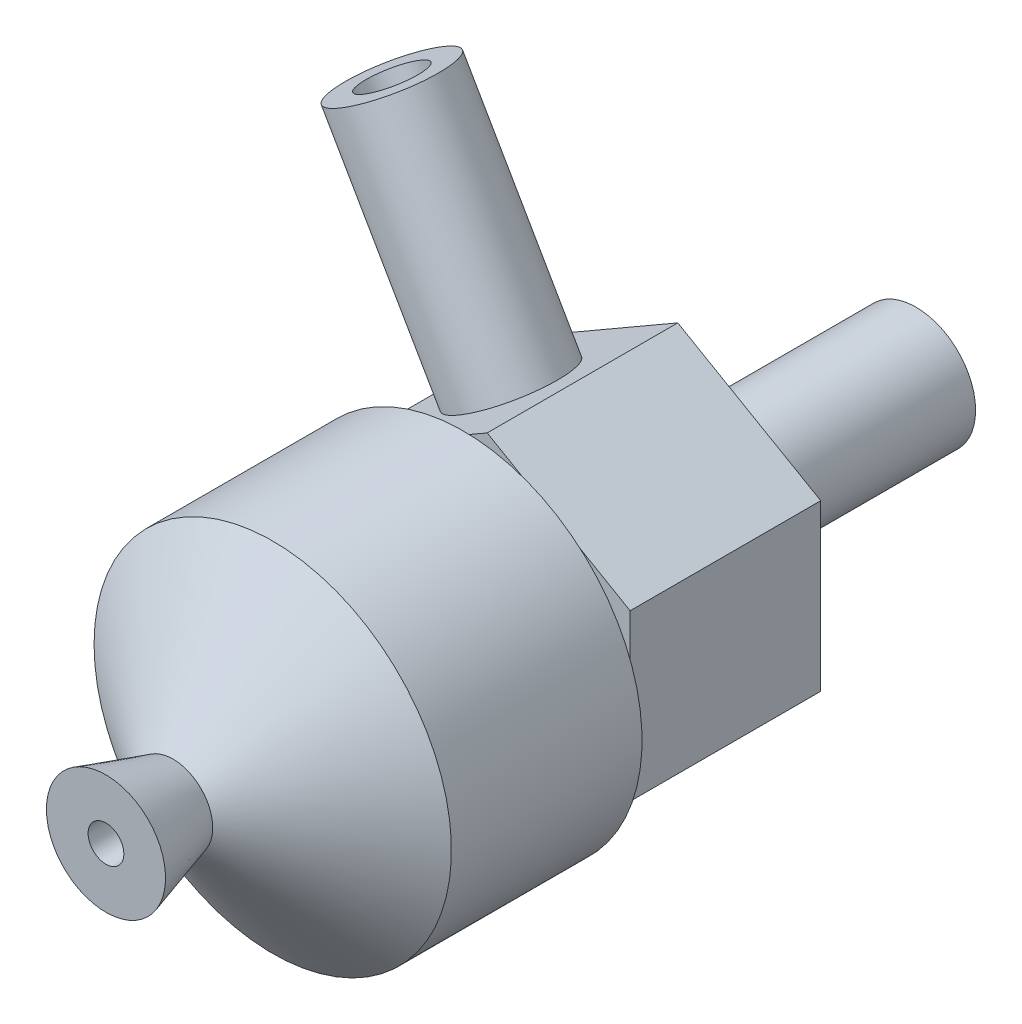
ISO-10303-21;
HEADER;
FILE_DESCRIPTION(('STEP AP214'),'2;1');
FILE_NAME('part.step','',(''),(''),'','','');
FILE_SCHEMA(('AUTOMOTIVE_DESIGN { 1 0 10303 214 1 1 1 1 }'));
ENDSEC;
DATA;
#1=APPLICATION_CONTEXT('core data for automotive mechanical design processes');
#2=APPLICATION_PROTOCOL_DEFINITION('international standard','automotive_design',2000,#1);
#3=PRODUCT_CONTEXT('',#1,'mechanical');
#4=PRODUCT('Part','Part','',(#3));
#5=PRODUCT_RELATED_PRODUCT_CATEGORY('part','',(#4));
#6=PRODUCT_DEFINITION_FORMATION('','',#4);
#7=PRODUCT_DEFINITION_CONTEXT('part definition',#1,'design');
#8=PRODUCT_DEFINITION('design','',#6,#7);
#9=PRODUCT_DEFINITION_SHAPE('','',#8);
#10=(LENGTH_UNIT() NAMED_UNIT(*) SI_UNIT(.MILLI.,.METRE.));
#11=(NAMED_UNIT(*) PLANE_ANGLE_UNIT() SI_UNIT($,.RADIAN.));
#12=(NAMED_UNIT(*) SI_UNIT($,.STERADIAN.) SOLID_ANGLE_UNIT());
#13=UNCERTAINTY_MEASURE_WITH_UNIT(LENGTH_MEASURE(1.E-05),#10,'distance_accuracy_value','');
#14=(GEOMETRIC_REPRESENTATION_CONTEXT(3) GLOBAL_UNCERTAINTY_ASSIGNED_CONTEXT((#13)) GLOBAL_UNIT_ASSIGNED_CONTEXT((#10,
#11,#12)) REPRESENTATION_CONTEXT('',''));
#15=CARTESIAN_POINT('',(0.,0.,0.));
#16=DIRECTION('',(0.,0.,1.));
#17=DIRECTION('',(1.,0.,0.));
#18=AXIS2_PLACEMENT_3D('',#15,#16,#17);
#19=CARTESIAN_POINT('',(0.,6.92820323027551,18.));
#20=DIRECTION('',(0.5,-0.866025403784439,0.));
#21=DIRECTION('',(0.866025403784439,0.5,0.));
#22=AXIS2_PLACEMENT_3D('',#19,#20,#21);
#23=PLANE('',#22);
#24=DIRECTION('',(-0.866025403784439,-0.5,0.));
#25=VECTOR('',#24,1.);
#26=CARTESIAN_POINT('',(0.,6.92820323027551,10.));
#27=LINE('',#26,#25);
#28=CARTESIAN_POINT('',(0.,6.92820323027551,10.));
#29=VERTEX_POINT('',#28);
#30=CARTESIAN_POINT('',(-6.,3.46410161513776,10.));
#31=VERTEX_POINT('',#30);
#32=EDGE_CURVE('E130',#29,#31,#27,.T.);
#33=ORIENTED_EDGE('',*,*,#32,.T.);
#34=DIRECTION('',(0.,0.,-1.));
#35=VECTOR('',#34,1.);
#36=CARTESIAN_POINT('',(-6.,3.46410161513776,18.));
#37=LINE('',#36,#35);
#38=CARTESIAN_POINT('',(-6.,3.46410161513776,18.));
#39=VERTEX_POINT('',#38);
#40=EDGE_CURVE('E115',#39,#31,#37,.T.);
#41=ORIENTED_EDGE('',*,*,#40,.F.);
#42=DIRECTION('',(-0.866025403784439,-0.5,0.));
#43=VECTOR('',#42,1.);
#44=CARTESIAN_POINT('',(0.,6.92820323027551,18.));
#45=LINE('',#44,#43);
#46=CARTESIAN_POINT('',(0.,6.92820323027551,18.));
#47=VERTEX_POINT('',#46);
#48=EDGE_CURVE('E106',#47,#39,#45,.T.);
#49=ORIENTED_EDGE('',*,*,#48,.F.);
#50=DIRECTION('',(0.,0.,-1.));
#51=VECTOR('',#50,1.);
#52=CARTESIAN_POINT('',(0.,6.92820323027551,18.));
#53=LINE('',#52,#51);
#54=EDGE_CURVE('E139',#47,#29,#53,.T.);
#55=ORIENTED_EDGE('',*,*,#54,.T.);
#56=EDGE_LOOP('',(#33,#41,#49,#55));
#57=FACE_BOUND('',#56,.T.);
#58=CARTESIAN_POINT('',(-3.,5.19615242270663,14.));
#59=DIRECTION('',(0.5,-0.866025403784439,0.));
#60=DIRECTION('',(0.866025403784439,0.5,0.));
#61=AXIS2_PLACEMENT_3D('',#58,#59,#60);
#62=CIRCLE('',#61,2.25);
#63=CARTESIAN_POINT('',(-1.05144284148501,6.32115242270663,14.));
#64=VERTEX_POINT('',#63);
#65=EDGE_CURVE('E11',#64,#64,#62,.F.);
#66=ORIENTED_EDGE('',*,*,#65,.F.);
#67=EDGE_LOOP('',(#66));
#68=FACE_BOUND('',#67,.T.);
#69=ADVANCED_FACE('F37',(#57,#68),#23,.F.);
#70=CARTESIAN_POINT('',(6.,3.46410161513775,18.));
#71=DIRECTION('',(0.,0.,1.));
#72=DIRECTION('',(1.,0.,0.));
#73=AXIS2_PLACEMENT_3D('',#70,#71,#72);
#74=PLANE('',#73);
#75=DIRECTION('',(0.,1.,0.));
#76=VECTOR('',#75,1.);
#77=CARTESIAN_POINT('',(6.,-3.46410161513776,18.));
#78=LINE('',#77,#76);
#79=CARTESIAN_POINT('',(6.,-3.46410161513776,18.));
#80=VERTEX_POINT('',#79);
#81=CARTESIAN_POINT('',(6.,3.46410161513775,18.));
#82=VERTEX_POINT('',#81);
#83=EDGE_CURVE('E135',#80,#82,#78,.T.);
#84=ORIENTED_EDGE('',*,*,#83,.T.);
#85=DIRECTION('',(-0.866025403784439,0.5,0.));
#86=VECTOR('',#85,1.);
#87=CARTESIAN_POINT('',(6.,3.46410161513775,18.));
#88=LINE('',#87,#86);
#89=EDGE_CURVE('E92',#82,#47,#88,.T.);
#90=ORIENTED_EDGE('',*,*,#89,.T.);
#91=ORIENTED_EDGE('',*,*,#48,.T.);
#92=DIRECTION('',(0.,-1.,0.));
#93=VECTOR('',#92,1.);
#94=CARTESIAN_POINT('',(-6.,3.46410161513776,18.));
#95=LINE('',#94,#93);
#96=CARTESIAN_POINT('',(-6.,-3.46410161513775,18.));
#97=VERTEX_POINT('',#96);
#98=EDGE_CURVE('E99',#39,#97,#95,.T.);
#99=ORIENTED_EDGE('',*,*,#98,.T.);
#100=DIRECTION('',(0.866025403784439,-0.5,0.));
#101=VECTOR('',#100,1.);
#102=CARTESIAN_POINT('',(-6.,-3.46410161513775,18.));
#103=LINE('',#102,#101);
#104=CARTESIAN_POINT('',(0.,-6.92820323027551,18.));
#105=VERTEX_POINT('',#104);
#106=EDGE_CURVE('E104',#97,#105,#103,.T.);
#107=ORIENTED_EDGE('',*,*,#106,.T.);
#108=DIRECTION('',(0.866025403784439,0.5,0.));
#109=VECTOR('',#108,1.);
#110=CARTESIAN_POINT('',(0.,-6.92820323027551,18.));
#111=LINE('',#110,#109);
#112=EDGE_CURVE('E54',#105,#80,#111,.T.);
#113=ORIENTED_EDGE('',*,*,#112,.T.);
#114=EDGE_LOOP('',(#84,#90,#91,#99,#107,#113));
#115=FACE_BOUND('',#114,.T.);
#116=CARTESIAN_POINT('',(0.,0.,18.));
#117=DIRECTION('',(0.,0.,1.));
#118=DIRECTION('',(1.,0.,0.));
#119=AXIS2_PLACEMENT_3D('',#116,#117,#118);
#120=CIRCLE('',#119,2.);
#121=CARTESIAN_POINT('',(2.,0.,18.));
#122=VERTEX_POINT('',#121);
#123=EDGE_CURVE('E187',#122,#122,#120,.T.);
#124=ORIENTED_EDGE('',*,*,#123,.F.);
#125=EDGE_LOOP('',(#124));
#126=FACE_BOUND('',#125,.T.);
#127=ADVANCED_FACE('F101',(#115,#126),#74,.T.);
#128=CARTESIAN_POINT('',(0.,0.,10.));
#129=DIRECTION('',(0.,0.,-1.));
#130=DIRECTION('',(-1.,0.,0.));
#131=AXIS2_PLACEMENT_3D('',#128,#129,#130);
#132=CYLINDRICAL_SURFACE('',#131,2.5);
#133=CARTESIAN_POINT('',(0.,0.,10.));
#134=DIRECTION('',(0.,0.,1.));
#135=DIRECTION('',(1.,0.,0.));
#136=AXIS2_PLACEMENT_3D('',#133,#134,#135);
#137=CIRCLE('',#136,2.5);
#138=CARTESIAN_POINT('',(2.5,0.,10.));
#139=VERTEX_POINT('',#138);
#140=EDGE_CURVE('E46',#139,#139,#137,.T.);
#141=ORIENTED_EDGE('',*,*,#140,.F.);
#142=EDGE_LOOP('',(#141));
#143=FACE_BOUND('',#142,.T.);
#144=CARTESIAN_POINT('',(0.,0.,0.));
#145=DIRECTION('',(0.,0.,1.));
#146=DIRECTION('',(1.,0.,0.));
#147=AXIS2_PLACEMENT_3D('',#144,#145,#146);
#148=CIRCLE('',#147,2.5);
#149=CARTESIAN_POINT('',(2.5,0.,0.));
#150=VERTEX_POINT('',#149);
#151=EDGE_CURVE('E144',#150,#150,#148,.T.);
#152=ORIENTED_EDGE('',*,*,#151,.T.);
#153=EDGE_LOOP('',(#152));
#154=FACE_BOUND('',#153,.T.);
#155=ADVANCED_FACE('F39',(#143,#154),#132,.T.);
#156=CARTESIAN_POINT('',(0.,0.,0.));
#157=DIRECTION('',(0.,0.,1.));
#158=DIRECTION('',(1.,0.,0.));
#159=AXIS2_PLACEMENT_3D('',#156,#157,#158);
#160=PLANE('',#159);
#161=ORIENTED_EDGE('',*,*,#151,.F.);
#162=EDGE_LOOP('',(#161));
#163=FACE_BOUND('',#162,.T.);
#164=ADVANCED_FACE('F150',(#163),#160,.F.);
#165=CARTESIAN_POINT('',(6.,3.46410161513775,10.));
#166=DIRECTION('',(0.,0.,1.));
#167=DIRECTION('',(1.,0.,0.));
#168=AXIS2_PLACEMENT_3D('',#165,#166,#167);
#169=PLANE('',#168);
#170=DIRECTION('',(0.,1.,0.));
#171=VECTOR('',#170,1.);
#172=CARTESIAN_POINT('',(6.,-3.46410161513776,10.));
#173=LINE('',#172,#171);
#174=CARTESIAN_POINT('',(6.,-3.46410161513776,10.));
#175=VERTEX_POINT('',#174);
#176=CARTESIAN_POINT('',(6.,3.46410161513775,10.));
#177=VERTEX_POINT('',#176);
#178=EDGE_CURVE('E124',#175,#177,#173,.T.);
#179=ORIENTED_EDGE('',*,*,#178,.F.);
#180=DIRECTION('',(0.866025403784439,0.5,0.));
#181=VECTOR('',#180,1.);
#182=CARTESIAN_POINT('',(0.,-6.92820323027551,10.));
#183=LINE('',#182,#181);
#184=CARTESIAN_POINT('',(0.,-6.92820323027551,10.));
#185=VERTEX_POINT('',#184);
#186=EDGE_CURVE('E83',#185,#175,#183,.T.);
#187=ORIENTED_EDGE('',*,*,#186,.F.);
#188=DIRECTION('',(0.866025403784439,-0.5,0.));
#189=VECTOR('',#188,1.);
#190=CARTESIAN_POINT('',(-6.,-3.46410161513775,10.));
#191=LINE('',#190,#189);
#192=CARTESIAN_POINT('',(-6.,-3.46410161513775,10.));
#193=VERTEX_POINT('',#192);
#194=EDGE_CURVE('E77',#193,#185,#191,.T.);
#195=ORIENTED_EDGE('',*,*,#194,.F.);
#196=DIRECTION('',(0.,-1.,0.));
#197=VECTOR('',#196,1.);
#198=CARTESIAN_POINT('',(-6.,3.46410161513776,10.));
#199=LINE('',#198,#197);
#200=EDGE_CURVE('E114',#31,#193,#199,.T.);
#201=ORIENTED_EDGE('',*,*,#200,.F.);
#202=ORIENTED_EDGE('',*,*,#32,.F.);
#203=DIRECTION('',(-0.866025403784439,0.5,0.));
#204=VECTOR('',#203,1.);
#205=CARTESIAN_POINT('',(6.,3.46410161513775,10.));
#206=LINE('',#205,#204);
#207=EDGE_CURVE('E127',#177,#29,#206,.T.);
#208=ORIENTED_EDGE('',*,*,#207,.F.);
#209=EDGE_LOOP('',(#179,#187,#195,#201,#202,#208));
#210=FACE_BOUND('',#209,.T.);
#211=ORIENTED_EDGE('',*,*,#140,.T.);
#212=EDGE_LOOP('',(#211));
#213=FACE_BOUND('',#212,.T.);
#214=ADVANCED_FACE('F152',(#210,#213),#169,.F.);
#215=CARTESIAN_POINT('',(6.,-3.46410161513776,18.));
#216=DIRECTION('',(-1.,0.,0.));
#217=DIRECTION('',(0.,0.,1.));
#218=AXIS2_PLACEMENT_3D('',#215,#216,#217);
#219=PLANE('',#218);
#220=ORIENTED_EDGE('',*,*,#178,.T.);
#221=DIRECTION('',(0.,0.,-1.));
#222=VECTOR('',#221,1.);
#223=CARTESIAN_POINT('',(6.,3.46410161513775,18.));
#224=LINE('',#223,#222);
#225=EDGE_CURVE('E142',#82,#177,#224,.T.);
#226=ORIENTED_EDGE('',*,*,#225,.F.);
#227=ORIENTED_EDGE('',*,*,#83,.F.);
#228=DIRECTION('',(0.,0.,-1.));
#229=VECTOR('',#228,1.);
#230=CARTESIAN_POINT('',(6.,-3.46410161513776,18.));
#231=LINE('',#230,#229);
#232=EDGE_CURVE('E120',#80,#175,#231,.T.);
#233=ORIENTED_EDGE('',*,*,#232,.T.);
#234=EDGE_LOOP('',(#220,#226,#227,#233));
#235=FACE_BOUND('',#234,.T.);
#236=ADVANCED_FACE('F157',(#235),#219,.F.);
#237=CARTESIAN_POINT('',(6.,3.46410161513775,18.));
#238=DIRECTION('',(-0.5,-0.866025403784439,0.));
#239=DIRECTION('',(0.866025403784439,-0.5,0.));
#240=AXIS2_PLACEMENT_3D('',#237,#238,#239);
#241=PLANE('',#240);
#242=ORIENTED_EDGE('',*,*,#207,.T.);
#243=ORIENTED_EDGE('',*,*,#54,.F.);
#244=ORIENTED_EDGE('',*,*,#89,.F.);
#245=ORIENTED_EDGE('',*,*,#225,.T.);
#246=EDGE_LOOP('',(#242,#243,#244,#245));
#247=FACE_BOUND('',#246,.T.);
#248=ADVANCED_FACE('F173',(#247),#241,.F.);
#249=CARTESIAN_POINT('',(-6.,3.46410161513776,18.));
#250=DIRECTION('',(1.,0.,0.));
#251=DIRECTION('',(0.,0.,-1.));
#252=AXIS2_PLACEMENT_3D('',#249,#250,#251);
#253=PLANE('',#252);
#254=ORIENTED_EDGE('',*,*,#200,.T.);
#255=DIRECTION('',(0.,0.,-1.));
#256=VECTOR('',#255,1.);
#257=CARTESIAN_POINT('',(-6.,-3.46410161513775,18.));
#258=LINE('',#257,#256);
#259=EDGE_CURVE('E111',#97,#193,#258,.T.);
#260=ORIENTED_EDGE('',*,*,#259,.F.);
#261=ORIENTED_EDGE('',*,*,#98,.F.);
#262=ORIENTED_EDGE('',*,*,#40,.T.);
#263=EDGE_LOOP('',(#254,#260,#261,#262));
#264=FACE_BOUND('',#263,.T.);
#265=ADVANCED_FACE('F112',(#264),#253,.F.);
#266=CARTESIAN_POINT('',(-6.,-3.46410161513775,18.));
#267=DIRECTION('',(0.5,0.866025403784439,0.));
#268=DIRECTION('',(-0.866025403784439,0.5,0.));
#269=AXIS2_PLACEMENT_3D('',#266,#267,#268);
#270=PLANE('',#269);
#271=ORIENTED_EDGE('',*,*,#194,.T.);
#272=DIRECTION('',(0.,0.,-1.));
#273=VECTOR('',#272,1.);
#274=CARTESIAN_POINT('',(0.,-6.92820323027551,18.));
#275=LINE('',#274,#273);
#276=EDGE_CURVE('E116',#105,#185,#275,.T.);
#277=ORIENTED_EDGE('',*,*,#276,.F.);
#278=ORIENTED_EDGE('',*,*,#106,.F.);
#279=ORIENTED_EDGE('',*,*,#259,.T.);
#280=EDGE_LOOP('',(#271,#277,#278,#279));
#281=FACE_BOUND('',#280,.T.);
#282=ADVANCED_FACE('F118',(#281),#270,.F.);
#283=CARTESIAN_POINT('',(0.,-6.92820323027551,18.));
#284=DIRECTION('',(-0.5,0.866025403784439,0.));
#285=DIRECTION('',(-0.866025403784439,-0.5,0.));
#286=AXIS2_PLACEMENT_3D('',#283,#284,#285);
#287=PLANE('',#286);
#288=CARTESIAN_POINT('',(3.,-5.19615242270662,14.));
#289=DIRECTION('',(-0.5,0.866025403784439,0.));
#290=DIRECTION('',(-0.866025403784439,-0.5,0.));
#291=AXIS2_PLACEMENT_3D('',#288,#289,#290);
#292=CIRCLE('',#291,1.25);
#293=CARTESIAN_POINT('',(1.91746824526945,-5.82115242270662,14.));
#294=VERTEX_POINT('',#293);
#295=EDGE_CURVE('E213',#294,#294,#292,.T.);
#296=ORIENTED_EDGE('',*,*,#295,.T.);
#297=EDGE_LOOP('',(#296));
#298=FACE_BOUND('',#297,.T.);
#299=ORIENTED_EDGE('',*,*,#186,.T.);
#300=ORIENTED_EDGE('',*,*,#232,.F.);
#301=ORIENTED_EDGE('',*,*,#112,.F.);
#302=ORIENTED_EDGE('',*,*,#276,.T.);
#303=EDGE_LOOP('',(#299,#300,#301,#302));
#304=FACE_BOUND('',#303,.T.);
#305=ADVANCED_FACE('F220',(#298,#304),#287,.F.);
#306=CARTESIAN_POINT('',(0.,0.,19.));
#307=DIRECTION('',(0.,0.,-1.));
#308=DIRECTION('',(-1.,0.,0.));
#309=AXIS2_PLACEMENT_3D('',#306,#307,#308);
#310=CYLINDRICAL_SURFACE('',#309,2.);
#311=CARTESIAN_POINT('',(0.,0.,19.));
#312=DIRECTION('',(0.,0.,1.));
#313=DIRECTION('',(1.,0.,0.));
#314=AXIS2_PLACEMENT_3D('',#311,#312,#313);
#315=CIRCLE('',#314,2.);
#316=CARTESIAN_POINT('',(2.,0.,19.));
#317=VERTEX_POINT('',#316);
#318=EDGE_CURVE('E128',#317,#317,#315,.T.);
#319=ORIENTED_EDGE('',*,*,#318,.F.);
#320=EDGE_LOOP('',(#319));
#321=FACE_BOUND('',#320,.T.);
#322=ORIENTED_EDGE('',*,*,#123,.T.);
#323=EDGE_LOOP('',(#322));
#324=FACE_BOUND('',#323,.T.);
#325=ADVANCED_FACE('F269',(#321,#324),#310,.T.);
#326=CARTESIAN_POINT('',(0.,0.,19.));
#327=DIRECTION('',(0.,0.,1.));
#328=DIRECTION('',(1.,0.,0.));
#329=AXIS2_PLACEMENT_3D('',#326,#327,#328);
#330=PLANE('',#329);
#331=CARTESIAN_POINT('',(0.,0.,19.));
#332=DIRECTION('',(0.,0.,-1.));
#333=DIRECTION('',(-1.,0.,0.));
#334=AXIS2_PLACEMENT_3D('',#331,#332,#333);
#335=CIRCLE('',#334,7.5);
#336=CARTESIAN_POINT('',(-7.5,0.,19.));
#337=VERTEX_POINT('',#336);
#338=EDGE_CURVE('E190',#337,#337,#335,.T.);
#339=ORIENTED_EDGE('',*,*,#338,.T.);
#340=EDGE_LOOP('',(#339));
#341=FACE_BOUND('',#340,.T.);
#342=ORIENTED_EDGE('',*,*,#318,.T.);
#343=EDGE_LOOP('',(#342));
#344=FACE_BOUND('',#343,.T.);
#345=ADVANCED_FACE('F265',(#341,#344),#330,.F.);
#346=CARTESIAN_POINT('',(0.,0.,19.));
#347=DIRECTION('',(0.,0.,-1.));
#348=DIRECTION('',(-1.,0.,0.));
#349=AXIS2_PLACEMENT_3D('',#346,#347,#348);
#350=CYLINDRICAL_SURFACE('',#349,7.5);
#351=ORIENTED_EDGE('',*,*,#338,.F.);
#352=EDGE_LOOP('',(#351));
#353=FACE_BOUND('',#352,.T.);
#354=CARTESIAN_POINT('',(0.,0.,27.));
#355=DIRECTION('',(0.,0.,-1.));
#356=DIRECTION('',(-1.,0.,0.));
#357=AXIS2_PLACEMENT_3D('',#354,#355,#356);
#358=CIRCLE('',#357,7.5);
#359=CARTESIAN_POINT('',(-7.5,0.,27.));
#360=VERTEX_POINT('',#359);
#361=EDGE_CURVE('E195',#360,#360,#358,.T.);
#362=ORIENTED_EDGE('',*,*,#361,.T.);
#363=EDGE_LOOP('',(#362));
#364=FACE_BOUND('',#363,.T.);
#365=ADVANCED_FACE('F261',(#353,#364),#350,.T.);
#366=CARTESIAN_POINT('',(0.,0.,31.1833587471366));
#367=DIRECTION('',(0.,0.,-1.));
#368=DIRECTION('',(-1.,0.,0.));
#369=AXIS2_PLACEMENT_3D('',#366,#367,#368);
#370=CONICAL_SURFACE('',#369,1.66420488302776,0.948854433267968);
#371=CARTESIAN_POINT('',(0.,0.,31.1833587471366));
#372=DIRECTION('',(0.,0.,-1.));
#373=DIRECTION('',(-1.,0.,0.));
#374=AXIS2_PLACEMENT_3D('',#371,#372,#373);
#375=CIRCLE('',#374,1.66420488302776);
#376=CARTESIAN_POINT('',(-1.66420488302776,0.,31.1833587471366));
#377=VERTEX_POINT('',#376);
#378=EDGE_CURVE('E198',#377,#377,#375,.T.);
#379=CARTESIAN_POINT('',(-7.5,0.,27.));
#380=CARTESIAN_POINT('',(-7.43921046753153,0.,27.043576653616));
#381=CARTESIAN_POINT('',(-7.37842093506307,0.,27.087153307232));
#382=CARTESIAN_POINT('',(-7.25684187012615,0.,27.174306614464));
#383=CARTESIAN_POINT('',(-7.19605233765769,0.,27.21788326808));
#384=CARTESIAN_POINT('',(-7.07447327272077,0.,27.305036575312));
#385=CARTESIAN_POINT('',(-7.01368374025231,0.,27.3486132289281));
#386=CARTESIAN_POINT('',(-6.89210467531539,0.,27.4357665361601));
#387=CARTESIAN_POINT('',(-6.83131514284693,0.,27.4793431897761));
#388=CARTESIAN_POINT('',(-6.70973607791001,0.,27.5664964970081));
#389=CARTESIAN_POINT('',(-6.64894654544155,0.,27.6100731506241));
#390=CARTESIAN_POINT('',(-6.52736748050462,0.,27.6972264578561));
#391=CARTESIAN_POINT('',(-6.46657794803616,0.,27.7408031114721));
#392=CARTESIAN_POINT('',(-6.34499888309924,0.,27.8279564187041));
#393=CARTESIAN_POINT('',(-6.28420935063078,0.,27.8715330723201));
#394=CARTESIAN_POINT('',(-6.16263028569386,0.,27.9586863795521));
#395=CARTESIAN_POINT('',(-6.1018407532254,0.,28.0022630331681));
#396=CARTESIAN_POINT('',(-5.98026168828848,0.,28.0894163404002));
#397=CARTESIAN_POINT('',(-5.91947215582001,0.,28.1329929940162));
#398=CARTESIAN_POINT('',(-5.79789309088309,0.,28.2201463012482));
#399=CARTESIAN_POINT('',(-5.73710355841463,0.,28.2637229548642));
#400=CARTESIAN_POINT('',(-5.61552449347771,0.,28.3508762620962));
#401=CARTESIAN_POINT('',(-5.55473496100925,0.,28.3944529157122));
#402=CARTESIAN_POINT('',(-5.43315589607233,0.,28.4816062229442));
#403=CARTESIAN_POINT('',(-5.37236636360387,0.,28.5251828765602));
#404=CARTESIAN_POINT('',(-5.25078729866695,0.,28.6123361837922));
#405=CARTESIAN_POINT('',(-5.18999776619849,0.,28.6559128374082));
#406=CARTESIAN_POINT('',(-5.06841870126157,0.,28.7430661446402));
#407=CARTESIAN_POINT('',(-5.0076291687931,0.,28.7866427982562));
#408=CARTESIAN_POINT('',(-4.88605010385618,0.,28.8737961054883));
#409=CARTESIAN_POINT('',(-4.82526057138772,0.,28.9173727591043));
#410=CARTESIAN_POINT('',(-4.7036815064508,0.,29.0045260663363));
#411=CARTESIAN_POINT('',(-4.64289197398234,0.,29.0481027199523));
#412=CARTESIAN_POINT('',(-4.52131290904542,0.,29.1352560271843));
#413=CARTESIAN_POINT('',(-4.46052337657696,0.,29.1788326808003));
#414=CARTESIAN_POINT('',(-4.33894431164004,0.,29.2659859880323));
#415=CARTESIAN_POINT('',(-4.27815477917157,0.,29.3095626416483));
#416=CARTESIAN_POINT('',(-4.15657571423465,0.,29.3967159488803));
#417=CARTESIAN_POINT('',(-4.09578618176619,0.,29.4402926024963));
#418=CARTESIAN_POINT('',(-3.97420711682927,0.,29.5274459097283));
#419=CARTESIAN_POINT('',(-3.91341758436081,0.,29.5710225633444));
#420=CARTESIAN_POINT('',(-3.79183851942389,0.,29.6581758705764));
#421=CARTESIAN_POINT('',(-3.73104898695543,0.,29.7017525241924));
#422=CARTESIAN_POINT('',(-3.60946992201851,0.,29.7889058314244));
#423=CARTESIAN_POINT('',(-3.54868038955004,0.,29.8324824850404));
#424=CARTESIAN_POINT('',(-3.42710132461312,0.,29.9196357922724));
#425=CARTESIAN_POINT('',(-3.36631179214466,0.,29.9632124458884));
#426=CARTESIAN_POINT('',(-3.24473272720774,0.,30.0503657531204));
#427=CARTESIAN_POINT('',(-3.18394319473928,0.,30.0939424067364));
#428=CARTESIAN_POINT('',(-3.06236412980236,0.,30.1810957139684));
#429=CARTESIAN_POINT('',(-3.0015745973339,0.,30.2246723675844));
#430=CARTESIAN_POINT('',(-2.87999553239698,0.,30.3118256748165));
#431=CARTESIAN_POINT('',(-2.81920599992852,0.,30.3554023284325));
#432=CARTESIAN_POINT('',(-2.69762693499159,0.,30.4425556356645));
#433=CARTESIAN_POINT('',(-2.63683740252313,0.,30.4861322892805));
#434=CARTESIAN_POINT('',(-2.51525833758621,0.,30.5732855965125));
#435=CARTESIAN_POINT('',(-2.45446880511775,0.,30.6168622501285));
#436=CARTESIAN_POINT('',(-2.33288974018083,0.,30.7040155573605));
#437=CARTESIAN_POINT('',(-2.27210020771237,0.,30.7475922109765));
#438=CARTESIAN_POINT('',(-2.15052114277545,0.,30.8347455182085));
#439=CARTESIAN_POINT('',(-2.08973161030699,0.,30.8783221718245));
#440=CARTESIAN_POINT('',(-1.96815254537006,0.,30.9654754790565));
#441=CARTESIAN_POINT('',(-1.9073630129016,0.,31.0090521326725));
#442=CARTESIAN_POINT('',(-1.78578394796468,0.,31.0962054399046));
#443=CARTESIAN_POINT('',(-1.72499441549622,0.,31.1397820935206));
#444=CARTESIAN_POINT('',(-1.66420488302776,0.,31.1833587471366));
#445=B_SPLINE_CURVE_WITH_KNOTS('',3,(#379,#380,#381,#382,#383,#384,#385,#386,#387,#388,#389,
#390,#391,#392,#393,#394,#395,#396,#397,#398,#399,#400,#401,#402,#403,#404,#405,#406,#407,#408,
#409,#410,#411,#412,#413,#414,#415,#416,#417,#418,#419,#420,#421,#422,#423,#424,#425,#426,#427,
#428,#429,#430,#431,#432,#433,#434,#435,#436,#437,#438,#439,#440,#441,#442,#443,#444),
.UNSPECIFIED.,.F.,.F.,(4,2,2,2,2,2,2,2,2,2,2,2,2,2,2,2,2,2,2,2,2,2,2,2,2,2,2,2,2,2,2,2,4),(0.,
0.224384999460595,0.448769998921189,0.673154998381782,0.897539997842376,1.12192499730297,
1.34630999676356,1.57069499622416,1.79507999568475,2.01946499514534,2.24384999460594,
2.46823499406653,2.69261999352712,2.91700499298772,3.14138999244831,3.36577499190891,
3.5901599913695,3.81454499083009,4.03892999029069,4.26331498975128,4.48769998921188,
4.71208498867247,4.93646998813306,5.16085498759366,5.38523998705425,5.60962498651484,
5.83400998597544,6.05839498543603,6.28277998489663,6.50716498435722,6.73154998381781,
6.95593498327841,7.180319982739),.UNSPECIFIED.);
#446=EDGE_CURVE('BSEAM257',#360,#377,#445,.T.);
#447=ORIENTED_EDGE('',*,*,#361,.F.);
#448=ORIENTED_EDGE('',*,*,#378,.T.);
#449=ORIENTED_EDGE('',*,*,#446,.T.);
#450=ORIENTED_EDGE('',*,*,#446,.F.);
#451=EDGE_LOOP('',(#447,#449,#448,#450));
#452=FACE_BOUND('',#451,.T.);
#453=ADVANCED_FACE('F257',(#452),#370,.T.);
#454=CARTESIAN_POINT('',(0.,0.,34.));
#455=DIRECTION('',(0.,0.,1.));
#456=DIRECTION('',(1.,0.,0.));
#457=AXIS2_PLACEMENT_3D('',#454,#455,#456);
#458=CONICAL_SURFACE('',#457,2.5,0.28845839455343);
#459=ORIENTED_EDGE('',*,*,#378,.F.);
#460=EDGE_LOOP('',(#459));
#461=FACE_BOUND('',#460,.T.);
#462=CARTESIAN_POINT('',(0.,0.,34.));
#463=DIRECTION('',(0.,0.,-1.));
#464=DIRECTION('',(-1.,0.,0.));
#465=AXIS2_PLACEMENT_3D('',#462,#463,#464);
#466=CIRCLE('',#465,2.5);
#467=CARTESIAN_POINT('',(-2.5,0.,34.));
#468=VERTEX_POINT('',#467);
#469=EDGE_CURVE('E201',#468,#468,#466,.T.);
#470=ORIENTED_EDGE('',*,*,#469,.T.);
#471=EDGE_LOOP('',(#470));
#472=FACE_BOUND('',#471,.T.);
#473=ADVANCED_FACE('F253',(#461,#472),#458,.T.);
#474=CARTESIAN_POINT('',(2.5,0.,34.));
#475=DIRECTION('',(0.,0.,-1.));
#476=DIRECTION('',(-1.,0.,0.));
#477=AXIS2_PLACEMENT_3D('',#474,#475,#476);
#478=PLANE('',#477);
#479=CARTESIAN_POINT('',(0.,0.,34.));
#480=DIRECTION('',(0.,0.,1.));
#481=DIRECTION('',(1.,0.,0.));
#482=AXIS2_PLACEMENT_3D('',#479,#480,#481);
#483=CIRCLE('',#482,0.75);
#484=CARTESIAN_POINT('',(0.749999999999999,0.,34.));
#485=VERTEX_POINT('',#484);
#486=EDGE_CURVE('E205',#485,#485,#483,.T.);
#487=ORIENTED_EDGE('',*,*,#486,.F.);
#488=EDGE_LOOP('',(#487));
#489=FACE_BOUND('',#488,.T.);
#490=ORIENTED_EDGE('',*,*,#469,.F.);
#491=EDGE_LOOP('',(#490));
#492=FACE_BOUND('',#491,.T.);
#493=ADVANCED_FACE('F249',(#489,#492),#478,.F.);
#494=CARTESIAN_POINT('',(0.,0.,19.));
#495=DIRECTION('',(0.,0.,1.));
#496=DIRECTION('',(1.,0.,0.));
#497=AXIS2_PLACEMENT_3D('',#494,#495,#496);
#498=CYLINDRICAL_SURFACE('',#497,0.75);
#499=CARTESIAN_POINT('',(0.,0.,19.));
#500=DIRECTION('',(0.,0.,1.));
#501=DIRECTION('',(1.,0.,0.));
#502=AXIS2_PLACEMENT_3D('',#499,#500,#501);
#503=CIRCLE('',#502,0.75);
#504=CARTESIAN_POINT('',(0.749999999999999,0.,19.));
#505=VERTEX_POINT('',#504);
#506=EDGE_CURVE('E204',#505,#505,#503,.T.);
#507=ORIENTED_EDGE('',*,*,#506,.F.);
#508=EDGE_LOOP('',(#507));
#509=FACE_BOUND('',#508,.T.);
#510=ORIENTED_EDGE('',*,*,#486,.T.);
#511=EDGE_LOOP('',(#510));
#512=FACE_BOUND('',#511,.T.);
#513=ADVANCED_FACE('F243',(#509,#512),#498,.F.);
#514=CARTESIAN_POINT('',(0.,0.,19.));
#515=DIRECTION('',(0.,0.,1.));
#516=DIRECTION('',(1.,0.,0.));
#517=AXIS2_PLACEMENT_3D('',#514,#515,#516);
#518=PLANE('',#517);
#519=ORIENTED_EDGE('',*,*,#506,.T.);
#520=EDGE_LOOP('',(#519));
#521=FACE_BOUND('',#520,.T.);
#522=ADVANCED_FACE('F237',(#521),#518,.T.);
#523=CARTESIAN_POINT('',(-8.,13.856406460551,14.));
#524=DIRECTION('',(0.5,-0.866025403784439,0.));
#525=DIRECTION('',(0.866025403784439,0.5,0.));
#526=AXIS2_PLACEMENT_3D('',#523,#524,#525);
#527=CYLINDRICAL_SURFACE('',#526,2.25);
#528=CARTESIAN_POINT('',(-8.,13.856406460551,14.));
#529=DIRECTION('',(-0.5,0.866025403784439,0.));
#530=DIRECTION('',(-0.866025403784439,-0.5,0.));
#531=AXIS2_PLACEMENT_3D('',#528,#529,#530);
#532=CIRCLE('',#531,2.25);
#533=CARTESIAN_POINT('',(-9.94855715851499,12.731406460551,14.));
#534=VERTEX_POINT('',#533);
#535=EDGE_CURVE('E208',#534,#534,#532,.T.);
#536=ORIENTED_EDGE('',*,*,#535,.F.);
#537=EDGE_LOOP('',(#536));
#538=FACE_BOUND('',#537,.T.);
#539=ORIENTED_EDGE('',*,*,#65,.T.);
#540=EDGE_LOOP('',(#539));
#541=FACE_BOUND('',#540,.T.);
#542=ADVANCED_FACE('F231',(#538,#541),#527,.T.);
#543=CARTESIAN_POINT('',(-8.,13.856406460551,14.));
#544=DIRECTION('',(-0.5,0.866025403784439,0.));
#545=DIRECTION('',(-0.866025403784439,-0.5,0.));
#546=AXIS2_PLACEMENT_3D('',#543,#544,#545);
#547=PLANE('',#546);
#548=CARTESIAN_POINT('',(-8.,13.856406460551,14.));
#549=DIRECTION('',(-0.5,0.866025403784439,0.));
#550=DIRECTION('',(-0.866025403784439,-0.5,0.));
#551=AXIS2_PLACEMENT_3D('',#548,#549,#550);
#552=CIRCLE('',#551,1.25);
#553=CARTESIAN_POINT('',(-9.08253175473055,13.231406460551,14.));
#554=VERTEX_POINT('',#553);
#555=EDGE_CURVE('E214',#554,#554,#552,.T.);
#556=ORIENTED_EDGE('',*,*,#555,.F.);
#557=EDGE_LOOP('',(#556));
#558=FACE_BOUND('',#557,.T.);
#559=ORIENTED_EDGE('',*,*,#535,.T.);
#560=EDGE_LOOP('',(#559));
#561=FACE_BOUND('',#560,.T.);
#562=ADVANCED_FACE('F225',(#558,#561),#547,.T.);
#563=CARTESIAN_POINT('',(3.,-5.19615242270662,14.));
#564=DIRECTION('',(-0.5,0.866025403784439,0.));
#565=DIRECTION('',(-0.866025403784439,-0.5,0.));
#566=AXIS2_PLACEMENT_3D('',#563,#564,#565);
#567=CYLINDRICAL_SURFACE('',#566,1.25);
#568=CARTESIAN_POINT('',(1.91746824526945,-5.82115242270662,14.));
#569=CARTESIAN_POINT('',(1.80288491193611,-5.62268826767269,14.));
#570=CARTESIAN_POINT('',(1.68830157860278,-5.42422411263875,14.));
#571=CARTESIAN_POINT('',(1.45913491193611,-5.02729580257088,14.));
#572=CARTESIAN_POINT('',(1.34455157860278,-4.82883164753695,14.));
#573=CARTESIAN_POINT('',(1.11538491193611,-4.43190333746908,14.));
#574=CARTESIAN_POINT('',(1.00080157860278,-4.23343918243515,14.));
#575=CARTESIAN_POINT('',(0.771634911936113,-3.83651087236728,14.));
#576=CARTESIAN_POINT('',(0.65705157860278,-3.63804671733335,14.));
#577=CARTESIAN_POINT('',(0.427884911936113,-3.24111840726548,14.));
#578=CARTESIAN_POINT('',(0.31330157860278,-3.04265425223155,14.));
#579=CARTESIAN_POINT('',(0.0841349119361135,-2.64572594216368,14.));
#580=CARTESIAN_POINT('',(-0.0304484213972199,-2.44726178712974,14.));
#581=CARTESIAN_POINT('',(-0.259615088063887,-2.05033347706188,14.));
#582=CARTESIAN_POINT('',(-0.37419842139722,-1.85186932202794,14.));
#583=CARTESIAN_POINT('',(-0.603365088063886,-1.45494101196007,14.));
#584=CARTESIAN_POINT('',(-0.71794842139722,-1.25647685692614,14.));
#585=CARTESIAN_POINT('',(-0.947115088063886,-0.859548546858272,14.));
#586=CARTESIAN_POINT('',(-1.06169842139722,-0.661084391824338,14.));
#587=CARTESIAN_POINT('',(-1.29086508806389,-0.264156081756471,14.));
#588=CARTESIAN_POINT('',(-1.40544842139722,-0.0656919267225372,14.));
#589=CARTESIAN_POINT('',(-1.63461508806389,0.331236383345331,14.));
#590=CARTESIAN_POINT('',(-1.74919842139722,0.529700538379265,14.));
#591=CARTESIAN_POINT('',(-1.97836508806389,0.926628848447133,14.));
#592=CARTESIAN_POINT('',(-2.09294842139722,1.12509300348107,14.));
#593=CARTESIAN_POINT('',(-2.32211508806389,1.52202131354893,14.));
#594=CARTESIAN_POINT('',(-2.43669842139722,1.72048546858287,14.));
#595=CARTESIAN_POINT('',(-2.66586508806389,2.11741377865074,14.));
#596=CARTESIAN_POINT('',(-2.78044842139722,2.31587793368467,14.));
#597=CARTESIAN_POINT('',(-3.00961508806389,2.71280624375254,14.));
#598=CARTESIAN_POINT('',(-3.12419842139722,2.91127039878647,14.));
#599=CARTESIAN_POINT('',(-3.35336508806389,3.30819870885434,14.));
#600=CARTESIAN_POINT('',(-3.46794842139722,3.50666286388827,14.));
#601=CARTESIAN_POINT('',(-3.69711508806389,3.90359117395614,14.));
#602=CARTESIAN_POINT('',(-3.81169842139722,4.10205532899007,14.));
#603=CARTESIAN_POINT('',(-4.04086508806389,4.49898363905794,14.));
#604=CARTESIAN_POINT('',(-4.15544842139722,4.69744779409188,14.));
#605=CARTESIAN_POINT('',(-4.38461508806389,5.09437610415974,14.));
#606=CARTESIAN_POINT('',(-4.49919842139722,5.29284025919368,14.));
#607=CARTESIAN_POINT('',(-4.72836508806389,5.68976856926154,14.));
#608=CARTESIAN_POINT('',(-4.84294842139722,5.88823272429548,14.));
#609=CARTESIAN_POINT('',(-5.07211508806389,6.28516103436335,14.));
#610=CARTESIAN_POINT('',(-5.18669842139722,6.48362518939728,14.));
#611=CARTESIAN_POINT('',(-5.41586508806389,6.88055349946515,14.));
#612=CARTESIAN_POINT('',(-5.53044842139722,7.07901765449908,14.));
#613=CARTESIAN_POINT('',(-5.75961508806389,7.47594596456695,14.));
#614=CARTESIAN_POINT('',(-5.87419842139722,7.67441011960088,14.));
#615=CARTESIAN_POINT('',(-6.10336508806388,8.07133842966875,14.));
#616=CARTESIAN_POINT('',(-6.21794842139722,8.26980258470268,14.));
#617=CARTESIAN_POINT('',(-6.44711508806389,8.66673089477055,14.));
#618=CARTESIAN_POINT('',(-6.56169842139722,8.86519504980449,14.));
#619=CARTESIAN_POINT('',(-6.79086508806388,9.26212335987235,14.));
#620=CARTESIAN_POINT('',(-6.90544842139722,9.46058751490629,14.));
#621=CARTESIAN_POINT('',(-7.13461508806388,9.85751582497416,14.));
#622=CARTESIAN_POINT('',(-7.24919842139722,10.0559799800081,14.));
#623=CARTESIAN_POINT('',(-7.47836508806389,10.452908290076,14.));
#624=CARTESIAN_POINT('',(-7.59294842139722,10.6513724451099,14.));
#625=CARTESIAN_POINT('',(-7.82211508806389,11.0483007551778,14.));
#626=CARTESIAN_POINT('',(-7.93669842139722,11.2467649102117,14.));
#627=CARTESIAN_POINT('',(-8.16586508806388,11.6436932202796,14.));
#628=CARTESIAN_POINT('',(-8.28044842139722,11.8421573753135,14.));
#629=CARTESIAN_POINT('',(-8.50961508806388,12.2390856853814,14.));
#630=CARTESIAN_POINT('',(-8.62419842139722,12.4375498404153,14.));
#631=CARTESIAN_POINT('',(-8.85336508806389,12.8344781504832,14.));
#632=CARTESIAN_POINT('',(-8.96794842139722,13.0329423055171,14.));
#633=CARTESIAN_POINT('',(-9.08253175473055,13.231406460551,14.));
#634=B_SPLINE_CURVE_WITH_KNOTS('',3,(#568,#569,#570,#571,#572,#573,#574,#575,#576,#577,#578,
#579,#580,#581,#582,#583,#584,#585,#586,#587,#588,#589,#590,#591,#592,#593,#594,#595,#596,#597,
#598,#599,#600,#601,#602,#603,#604,#605,#606,#607,#608,#609,#610,#611,#612,#613,#614,#615,#616,
#617,#618,#619,#620,#621,#622,#623,#624,#625,#626,#627,#628,#629,#630,#631,#632,#633),
.UNSPECIFIED.,.F.,.F.,(4,2,2,2,2,2,2,2,2,2,2,2,2,2,2,2,2,2,2,2,2,2,2,2,2,2,2,2,2,2,2,2,4),(0.,
0.6875,1.375,2.0625,2.75,3.4375,4.125,4.8125,5.5,6.1875,6.875,7.5625,8.25,8.9375,9.625,10.3125,
11.,11.6875,12.375,13.0625,13.75,14.4375,15.125,15.8125,16.5,17.1875,17.875,18.5625,19.25,
19.9375,20.625,21.3125,22.),.UNSPECIFIED.);
#635=EDGE_CURVE('BSEAM222',#294,#554,#634,.T.);
#636=ORIENTED_EDGE('',*,*,#295,.F.);
#637=ORIENTED_EDGE('',*,*,#555,.T.);
#638=ORIENTED_EDGE('',*,*,#635,.T.);
#639=ORIENTED_EDGE('',*,*,#635,.F.);
#640=EDGE_LOOP('',(#636,#638,#637,#639));
#641=FACE_BOUND('',#640,.T.);
#642=ADVANCED_FACE('F222',(#641),#567,.F.);
#643=CLOSED_SHELL('',(#69,#127,#155,#164,#214,#236,#248,#265,#282,#305,#325,#345,#365,#453,#473,
#493,#513,#522,#542,#562,#642));
#644=MANIFOLD_SOLID_BREP('B2',#643);
#645=ADVANCED_BREP_SHAPE_REPRESENTATION('',(#18,#644),#14);
#646=SHAPE_DEFINITION_REPRESENTATION(#9,#645);
ENDSEC;
END-ISO-10303-21;
